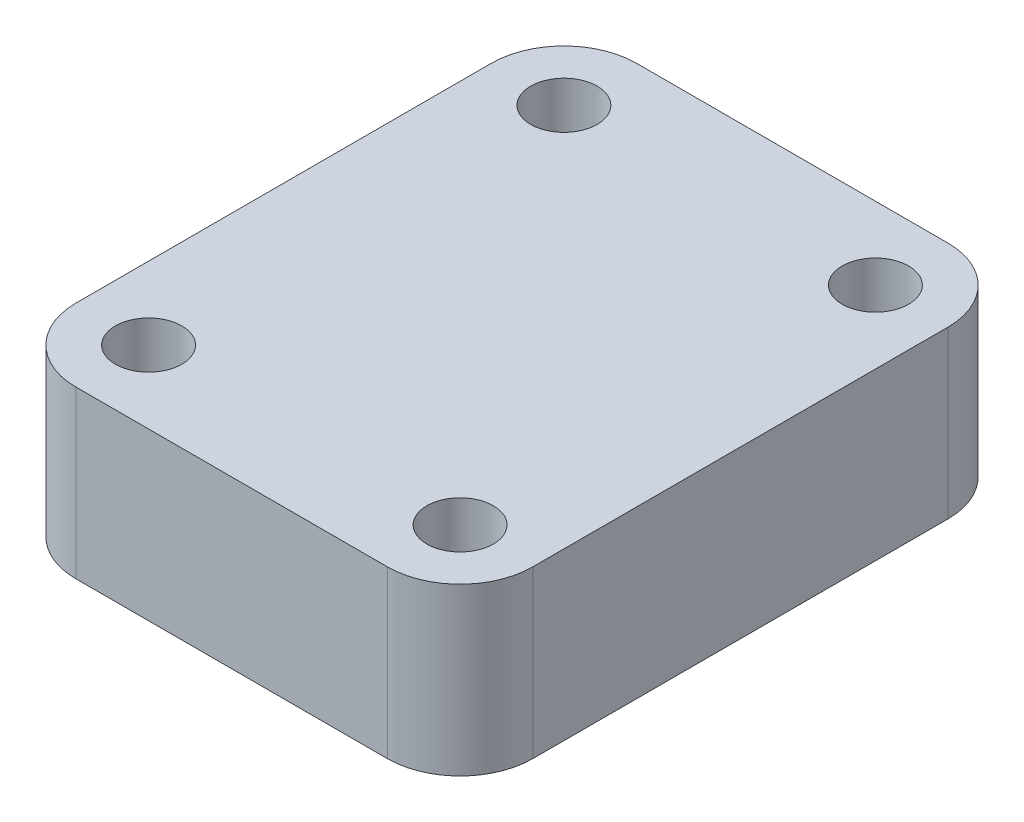
ISO-10303-21;
HEADER;
FILE_DESCRIPTION(('STEP AP214'),'2;1');
FILE_NAME('part.step','',(''),(''),'','','');
FILE_SCHEMA(('AUTOMOTIVE_DESIGN { 1 0 10303 214 1 1 1 1 }'));
ENDSEC;
DATA;
#1=APPLICATION_CONTEXT('core data for automotive mechanical design processes');
#2=APPLICATION_PROTOCOL_DEFINITION('international standard','automotive_design',2000,#1);
#3=PRODUCT_CONTEXT('',#1,'mechanical');
#4=PRODUCT('Part','Part','',(#3));
#5=PRODUCT_RELATED_PRODUCT_CATEGORY('part','',(#4));
#6=PRODUCT_DEFINITION_FORMATION('','',#4);
#7=PRODUCT_DEFINITION_CONTEXT('part definition',#1,'design');
#8=PRODUCT_DEFINITION('design','',#6,#7);
#9=PRODUCT_DEFINITION_SHAPE('','',#8);
#10=(LENGTH_UNIT() NAMED_UNIT(*) SI_UNIT(.MILLI.,.METRE.));
#11=(NAMED_UNIT(*) PLANE_ANGLE_UNIT() SI_UNIT($,.RADIAN.));
#12=(NAMED_UNIT(*) SI_UNIT($,.STERADIAN.) SOLID_ANGLE_UNIT());
#13=UNCERTAINTY_MEASURE_WITH_UNIT(LENGTH_MEASURE(1.E-05),#10,'distance_accuracy_value','');
#14=(GEOMETRIC_REPRESENTATION_CONTEXT(3) GLOBAL_UNCERTAINTY_ASSIGNED_CONTEXT((#13)) GLOBAL_UNIT_ASSIGNED_CONTEXT((#10,
#11,#12)) REPRESENTATION_CONTEXT('',''));
#15=CARTESIAN_POINT('',(0.,0.,0.));
#16=DIRECTION('',(0.,0.,1.));
#17=DIRECTION('',(1.,0.,0.));
#18=AXIS2_PLACEMENT_3D('',#15,#16,#17);
#19=CARTESIAN_POINT('',(-11.,8.,13.5));
#20=DIRECTION('',(1.,0.,0.));
#21=DIRECTION('',(0.,0.,-1.));
#22=AXIS2_PLACEMENT_3D('',#19,#20,#21);
#23=PLANE('',#22);
#24=DIRECTION('',(0.,0.,1.));
#25=VECTOR('',#24,1.);
#26=CARTESIAN_POINT('',(-11.,8.,13.5));
#27=LINE('',#26,#25);
#28=CARTESIAN_POINT('',(-11.,8.,-10.));
#29=VERTEX_POINT('',#28);
#30=CARTESIAN_POINT('',(-11.,8.,10.));
#31=VERTEX_POINT('',#30);
#32=EDGE_CURVE('E124',#29,#31,#27,.T.);
#33=ORIENTED_EDGE('',*,*,#32,.F.);
#34=DIRECTION('',(0.,-1.,0.));
#35=VECTOR('',#34,1.);
#36=CARTESIAN_POINT('',(-11.,8.,-10.));
#37=LINE('',#36,#35);
#38=CARTESIAN_POINT('',(-11.,0.,-10.));
#39=VERTEX_POINT('',#38);
#40=EDGE_CURVE('E109',#29,#39,#37,.T.);
#41=ORIENTED_EDGE('',*,*,#40,.T.);
#42=DIRECTION('',(0.,0.,1.));
#43=VECTOR('',#42,1.);
#44=CARTESIAN_POINT('',(-11.,0.,13.5));
#45=LINE('',#44,#43);
#46=CARTESIAN_POINT('',(-11.,0.,10.));
#47=VERTEX_POINT('',#46);
#48=EDGE_CURVE('E121',#39,#47,#45,.T.);
#49=ORIENTED_EDGE('',*,*,#48,.T.);
#50=DIRECTION('',(0.,-1.,0.));
#51=VECTOR('',#50,1.);
#52=CARTESIAN_POINT('',(-11.,8.,10.));
#53=LINE('',#52,#51);
#54=EDGE_CURVE('E126',#47,#31,#53,.F.);
#55=ORIENTED_EDGE('',*,*,#54,.T.);
#56=EDGE_LOOP('',(#33,#41,#49,#55));
#57=FACE_BOUND('',#56,.T.);
#58=ADVANCED_FACE('F39',(#57),#23,.F.);
#59=CARTESIAN_POINT('',(11.,8.,13.5));
#60=DIRECTION('',(0.,0.,-1.));
#61=DIRECTION('',(-1.,0.,0.));
#62=AXIS2_PLACEMENT_3D('',#59,#60,#61);
#63=PLANE('',#62);
#64=DIRECTION('',(1.,0.,0.));
#65=VECTOR('',#64,1.);
#66=CARTESIAN_POINT('',(11.,0.,13.5));
#67=LINE('',#66,#65);
#68=CARTESIAN_POINT('',(-7.5,0.,13.5));
#69=VERTEX_POINT('',#68);
#70=CARTESIAN_POINT('',(7.5,0.,13.5));
#71=VERTEX_POINT('',#70);
#72=EDGE_CURVE('E130',#69,#71,#67,.T.);
#73=ORIENTED_EDGE('',*,*,#72,.T.);
#74=DIRECTION('',(0.,-1.,0.));
#75=VECTOR('',#74,1.);
#76=CARTESIAN_POINT('',(7.5,8.,13.5));
#77=LINE('',#76,#75);
#78=CARTESIAN_POINT('',(7.5,8.,13.5));
#79=VERTEX_POINT('',#78);
#80=EDGE_CURVE('E11',#71,#79,#77,.F.);
#81=ORIENTED_EDGE('',*,*,#80,.T.);
#82=DIRECTION('',(1.,0.,0.));
#83=VECTOR('',#82,1.);
#84=CARTESIAN_POINT('',(11.,8.,13.5));
#85=LINE('',#84,#83);
#86=CARTESIAN_POINT('',(-7.5,8.,13.5));
#87=VERTEX_POINT('',#86);
#88=EDGE_CURVE('E170',#87,#79,#85,.T.);
#89=ORIENTED_EDGE('',*,*,#88,.F.);
#90=DIRECTION('',(0.,-1.,0.));
#91=VECTOR('',#90,1.);
#92=CARTESIAN_POINT('',(-7.5,8.,13.5));
#93=LINE('',#92,#91);
#94=EDGE_CURVE('E47',#87,#69,#93,.T.);
#95=ORIENTED_EDGE('',*,*,#94,.T.);
#96=EDGE_LOOP('',(#73,#81,#89,#95));
#97=FACE_BOUND('',#96,.T.);
#98=ADVANCED_FACE('F168',(#97),#63,.F.);
#99=CARTESIAN_POINT('',(11.,8.,13.5));
#100=DIRECTION('',(-1.,0.,0.));
#101=DIRECTION('',(0.,0.,1.));
#102=AXIS2_PLACEMENT_3D('',#99,#100,#101);
#103=PLANE('',#102);
#104=DIRECTION('',(0.,0.,-1.));
#105=VECTOR('',#104,1.);
#106=CARTESIAN_POINT('',(11.,0.,13.5));
#107=LINE('',#106,#105);
#108=CARTESIAN_POINT('',(11.,0.,10.));
#109=VERTEX_POINT('',#108);
#110=CARTESIAN_POINT('',(11.,0.,-10.));
#111=VERTEX_POINT('',#110);
#112=EDGE_CURVE('E134',#109,#111,#107,.T.);
#113=ORIENTED_EDGE('',*,*,#112,.T.);
#114=DIRECTION('',(0.,-1.,0.));
#115=VECTOR('',#114,1.);
#116=CARTESIAN_POINT('',(11.,8.,-10.));
#117=LINE('',#116,#115);
#118=CARTESIAN_POINT('',(11.,8.,-10.));
#119=VERTEX_POINT('',#118);
#120=EDGE_CURVE('E54',#111,#119,#117,.F.);
#121=ORIENTED_EDGE('',*,*,#120,.T.);
#122=DIRECTION('',(0.,0.,-1.));
#123=VECTOR('',#122,1.);
#124=CARTESIAN_POINT('',(11.,8.,13.5));
#125=LINE('',#124,#123);
#126=CARTESIAN_POINT('',(11.,8.,10.));
#127=VERTEX_POINT('',#126);
#128=EDGE_CURVE('E178',#127,#119,#125,.T.);
#129=ORIENTED_EDGE('',*,*,#128,.F.);
#130=DIRECTION('',(0.,-1.,0.));
#131=VECTOR('',#130,1.);
#132=CARTESIAN_POINT('',(11.,8.,10.));
#133=LINE('',#132,#131);
#134=EDGE_CURVE('E161',#127,#109,#133,.T.);
#135=ORIENTED_EDGE('',*,*,#134,.T.);
#136=EDGE_LOOP('',(#113,#121,#129,#135));
#137=FACE_BOUND('',#136,.T.);
#138=ADVANCED_FACE('F177',(#137),#103,.F.);
#139=CARTESIAN_POINT('',(11.,8.,-13.5));
#140=DIRECTION('',(0.,0.,1.));
#141=DIRECTION('',(1.,0.,0.));
#142=AXIS2_PLACEMENT_3D('',#139,#140,#141);
#143=PLANE('',#142);
#144=DIRECTION('',(-1.,0.,0.));
#145=VECTOR('',#144,1.);
#146=CARTESIAN_POINT('',(11.,0.,-13.5));
#147=LINE('',#146,#145);
#148=CARTESIAN_POINT('',(7.5,0.,-13.5));
#149=VERTEX_POINT('',#148);
#150=CARTESIAN_POINT('',(-7.5,0.,-13.5));
#151=VERTEX_POINT('',#150);
#152=EDGE_CURVE('E144',#149,#151,#147,.T.);
#153=ORIENTED_EDGE('',*,*,#152,.T.);
#154=DIRECTION('',(0.,-1.,0.));
#155=VECTOR('',#154,1.);
#156=CARTESIAN_POINT('',(-7.5,8.,-13.5));
#157=LINE('',#156,#155);
#158=CARTESIAN_POINT('',(-7.5,8.,-13.5));
#159=VERTEX_POINT('',#158);
#160=EDGE_CURVE('E110',#151,#159,#157,.F.);
#161=ORIENTED_EDGE('',*,*,#160,.T.);
#162=DIRECTION('',(-1.,0.,0.));
#163=VECTOR('',#162,1.);
#164=CARTESIAN_POINT('',(11.,8.,-13.5));
#165=LINE('',#164,#163);
#166=CARTESIAN_POINT('',(7.5,8.,-13.5));
#167=VERTEX_POINT('',#166);
#168=EDGE_CURVE('E140',#167,#159,#165,.T.);
#169=ORIENTED_EDGE('',*,*,#168,.F.);
#170=DIRECTION('',(0.,-1.,0.));
#171=VECTOR('',#170,1.);
#172=CARTESIAN_POINT('',(7.5,8.,-13.5));
#173=LINE('',#172,#171);
#174=EDGE_CURVE('E115',#167,#149,#173,.T.);
#175=ORIENTED_EDGE('',*,*,#174,.T.);
#176=EDGE_LOOP('',(#153,#161,#169,#175));
#177=FACE_BOUND('',#176,.T.);
#178=ADVANCED_FACE('F210',(#177),#143,.F.);
#179=CARTESIAN_POINT('',(0.,8.,0.));
#180=DIRECTION('',(0.,1.,0.));
#181=DIRECTION('',(0.,0.,1.));
#182=AXIS2_PLACEMENT_3D('',#179,#180,#181);
#183=PLANE('',#182);
#184=CARTESIAN_POINT('',(-7.5,8.,10.));
#185=DIRECTION('',(0.,1.,0.));
#186=DIRECTION('',(0.,0.,1.));
#187=AXIS2_PLACEMENT_3D('',#184,#185,#186);
#188=CIRCLE('',#187,1.59999999999999);
#189=CARTESIAN_POINT('',(-7.5,8.,11.6));
#190=VERTEX_POINT('',#189);
#191=EDGE_CURVE('E201',#190,#190,#188,.T.);
#192=ORIENTED_EDGE('',*,*,#191,.F.);
#193=EDGE_LOOP('',(#192));
#194=FACE_BOUND('',#193,.T.);
#195=CARTESIAN_POINT('',(-7.5,8.,-10.));
#196=DIRECTION('',(0.,1.,0.));
#197=DIRECTION('',(0.,0.,1.));
#198=AXIS2_PLACEMENT_3D('',#195,#196,#197);
#199=CIRCLE('',#198,1.59999999999999);
#200=CARTESIAN_POINT('',(-7.5,8.,-8.40000000000001));
#201=VERTEX_POINT('',#200);
#202=EDGE_CURVE('E195',#201,#201,#199,.T.);
#203=ORIENTED_EDGE('',*,*,#202,.F.);
#204=EDGE_LOOP('',(#203));
#205=FACE_BOUND('',#204,.T.);
#206=CARTESIAN_POINT('',(7.5,8.,-10.));
#207=DIRECTION('',(0.,1.,0.));
#208=DIRECTION('',(0.,0.,1.));
#209=AXIS2_PLACEMENT_3D('',#206,#207,#208);
#210=CIRCLE('',#209,1.59999999999999);
#211=CARTESIAN_POINT('',(7.5,8.,-8.40000000000001));
#212=VERTEX_POINT('',#211);
#213=EDGE_CURVE('E189',#212,#212,#210,.T.);
#214=ORIENTED_EDGE('',*,*,#213,.F.);
#215=EDGE_LOOP('',(#214));
#216=FACE_BOUND('',#215,.T.);
#217=CARTESIAN_POINT('',(7.5,8.,10.));
#218=DIRECTION('',(0.,1.,0.));
#219=DIRECTION('',(0.,0.,1.));
#220=AXIS2_PLACEMENT_3D('',#217,#218,#219);
#221=CIRCLE('',#220,1.59999999999999);
#222=CARTESIAN_POINT('',(7.5,8.,11.6));
#223=VERTEX_POINT('',#222);
#224=EDGE_CURVE('E137',#223,#223,#221,.T.);
#225=ORIENTED_EDGE('',*,*,#224,.F.);
#226=EDGE_LOOP('',(#225));
#227=FACE_BOUND('',#226,.T.);
#228=ORIENTED_EDGE('',*,*,#168,.T.);
#229=CARTESIAN_POINT('',(-7.5,8.,-10.));
#230=DIRECTION('',(0.,1.,0.));
#231=DIRECTION('',(0.,0.,1.));
#232=AXIS2_PLACEMENT_3D('',#229,#230,#231);
#233=CIRCLE('',#232,3.5);
#234=EDGE_CURVE('E159',#159,#29,#233,.T.);
#235=ORIENTED_EDGE('',*,*,#234,.T.);
#236=ORIENTED_EDGE('',*,*,#32,.T.);
#237=CARTESIAN_POINT('',(-7.5,8.,10.));
#238=DIRECTION('',(0.,1.,0.));
#239=DIRECTION('',(0.,0.,1.));
#240=AXIS2_PLACEMENT_3D('',#237,#238,#239);
#241=CIRCLE('',#240,3.5);
#242=EDGE_CURVE('E154',#31,#87,#241,.T.);
#243=ORIENTED_EDGE('',*,*,#242,.T.);
#244=ORIENTED_EDGE('',*,*,#88,.T.);
#245=CARTESIAN_POINT('',(7.5,8.,10.));
#246=DIRECTION('',(0.,1.,0.));
#247=DIRECTION('',(0.,0.,1.));
#248=AXIS2_PLACEMENT_3D('',#245,#246,#247);
#249=CIRCLE('',#248,3.5);
#250=EDGE_CURVE('E61',#79,#127,#249,.T.);
#251=ORIENTED_EDGE('',*,*,#250,.T.);
#252=ORIENTED_EDGE('',*,*,#128,.T.);
#253=CARTESIAN_POINT('',(7.5,8.,-10.));
#254=DIRECTION('',(0.,1.,0.));
#255=DIRECTION('',(0.,0.,1.));
#256=AXIS2_PLACEMENT_3D('',#253,#254,#255);
#257=CIRCLE('',#256,3.5);
#258=EDGE_CURVE('E157',#119,#167,#257,.T.);
#259=ORIENTED_EDGE('',*,*,#258,.T.);
#260=EDGE_LOOP('',(#228,#235,#236,#243,#244,#251,#252,#259));
#261=FACE_BOUND('',#260,.T.);
#262=ADVANCED_FACE('F207',(#194,#205,#216,#227,#261),#183,.T.);
#263=CARTESIAN_POINT('',(0.,0.,0.));
#264=DIRECTION('',(0.,1.,0.));
#265=DIRECTION('',(0.,0.,1.));
#266=AXIS2_PLACEMENT_3D('',#263,#264,#265);
#267=PLANE('',#266);
#268=CARTESIAN_POINT('',(-7.5,0.,10.));
#269=DIRECTION('',(0.,1.,0.));
#270=DIRECTION('',(0.,0.,1.));
#271=AXIS2_PLACEMENT_3D('',#268,#269,#270);
#272=CIRCLE('',#271,1.6);
#273=CARTESIAN_POINT('',(-7.5,0.,11.6));
#274=VERTEX_POINT('',#273);
#275=EDGE_CURVE('E198',#274,#274,#272,.T.);
#276=ORIENTED_EDGE('',*,*,#275,.T.);
#277=EDGE_LOOP('',(#276));
#278=FACE_BOUND('',#277,.T.);
#279=CARTESIAN_POINT('',(-7.5,0.,-10.));
#280=DIRECTION('',(0.,1.,0.));
#281=DIRECTION('',(0.,0.,1.));
#282=AXIS2_PLACEMENT_3D('',#279,#280,#281);
#283=CIRCLE('',#282,1.6);
#284=CARTESIAN_POINT('',(-7.5,0.,-8.4));
#285=VERTEX_POINT('',#284);
#286=EDGE_CURVE('E192',#285,#285,#283,.T.);
#287=ORIENTED_EDGE('',*,*,#286,.T.);
#288=EDGE_LOOP('',(#287));
#289=FACE_BOUND('',#288,.T.);
#290=CARTESIAN_POINT('',(7.5,0.,-10.));
#291=DIRECTION('',(0.,1.,0.));
#292=DIRECTION('',(0.,0.,1.));
#293=AXIS2_PLACEMENT_3D('',#290,#291,#292);
#294=CIRCLE('',#293,1.6);
#295=CARTESIAN_POINT('',(7.5,0.,-8.4));
#296=VERTEX_POINT('',#295);
#297=EDGE_CURVE('E186',#296,#296,#294,.T.);
#298=ORIENTED_EDGE('',*,*,#297,.T.);
#299=EDGE_LOOP('',(#298));
#300=FACE_BOUND('',#299,.T.);
#301=CARTESIAN_POINT('',(7.5,0.,10.));
#302=DIRECTION('',(0.,1.,0.));
#303=DIRECTION('',(0.,0.,1.));
#304=AXIS2_PLACEMENT_3D('',#301,#302,#303);
#305=CIRCLE('',#304,1.6);
#306=CARTESIAN_POINT('',(7.5,0.,11.6));
#307=VERTEX_POINT('',#306);
#308=EDGE_CURVE('E131',#307,#307,#305,.T.);
#309=ORIENTED_EDGE('',*,*,#308,.T.);
#310=EDGE_LOOP('',(#309));
#311=FACE_BOUND('',#310,.T.);
#312=ORIENTED_EDGE('',*,*,#48,.F.);
#313=CARTESIAN_POINT('',(-7.5,0.,-10.));
#314=DIRECTION('',(0.,1.,0.));
#315=DIRECTION('',(0.,0.,1.));
#316=AXIS2_PLACEMENT_3D('',#313,#314,#315);
#317=CIRCLE('',#316,3.5);
#318=EDGE_CURVE('E105',#39,#151,#317,.F.);
#319=ORIENTED_EDGE('',*,*,#318,.T.);
#320=ORIENTED_EDGE('',*,*,#152,.F.);
#321=CARTESIAN_POINT('',(7.5,0.,-10.));
#322=DIRECTION('',(0.,1.,0.));
#323=DIRECTION('',(0.,0.,1.));
#324=AXIS2_PLACEMENT_3D('',#321,#322,#323);
#325=CIRCLE('',#324,3.5);
#326=EDGE_CURVE('E116',#149,#111,#325,.F.);
#327=ORIENTED_EDGE('',*,*,#326,.T.);
#328=ORIENTED_EDGE('',*,*,#112,.F.);
#329=CARTESIAN_POINT('',(7.5,0.,10.));
#330=DIRECTION('',(0.,1.,0.));
#331=DIRECTION('',(0.,0.,1.));
#332=AXIS2_PLACEMENT_3D('',#329,#330,#331);
#333=CIRCLE('',#332,3.5);
#334=EDGE_CURVE('E148',#109,#71,#333,.F.);
#335=ORIENTED_EDGE('',*,*,#334,.T.);
#336=ORIENTED_EDGE('',*,*,#72,.F.);
#337=CARTESIAN_POINT('',(-7.5,0.,10.));
#338=DIRECTION('',(0.,1.,0.));
#339=DIRECTION('',(0.,0.,1.));
#340=AXIS2_PLACEMENT_3D('',#337,#338,#339);
#341=CIRCLE('',#340,3.5);
#342=EDGE_CURVE('E125',#69,#47,#341,.F.);
#343=ORIENTED_EDGE('',*,*,#342,.T.);
#344=EDGE_LOOP('',(#312,#319,#320,#327,#328,#335,#336,#343));
#345=FACE_BOUND('',#344,.T.);
#346=ADVANCED_FACE('F128',(#278,#289,#300,#311,#345),#267,.F.);
#347=CARTESIAN_POINT('',(7.5,8.,10.));
#348=DIRECTION('',(0.,1.,0.));
#349=DIRECTION('',(0.,0.,1.));
#350=AXIS2_PLACEMENT_3D('',#347,#348,#349);
#351=CYLINDRICAL_SURFACE('',#350,1.59999999999999);
#352=ORIENTED_EDGE('',*,*,#308,.F.);
#353=EDGE_LOOP('',(#352));
#354=FACE_BOUND('',#353,.T.);
#355=ORIENTED_EDGE('',*,*,#224,.T.);
#356=EDGE_LOOP('',(#355));
#357=FACE_BOUND('',#356,.T.);
#358=ADVANCED_FACE('F241',(#354,#357),#351,.F.);
#359=CARTESIAN_POINT('',(7.5,8.,-10.));
#360=DIRECTION('',(0.,1.,0.));
#361=DIRECTION('',(0.,0.,1.));
#362=AXIS2_PLACEMENT_3D('',#359,#360,#361);
#363=CYLINDRICAL_SURFACE('',#362,1.59999999999999);
#364=ORIENTED_EDGE('',*,*,#297,.F.);
#365=EDGE_LOOP('',(#364));
#366=FACE_BOUND('',#365,.T.);
#367=ORIENTED_EDGE('',*,*,#213,.T.);
#368=EDGE_LOOP('',(#367));
#369=FACE_BOUND('',#368,.T.);
#370=ADVANCED_FACE('F246',(#366,#369),#363,.F.);
#371=CARTESIAN_POINT('',(-7.5,8.,-10.));
#372=DIRECTION('',(0.,1.,0.));
#373=DIRECTION('',(0.,0.,1.));
#374=AXIS2_PLACEMENT_3D('',#371,#372,#373);
#375=CYLINDRICAL_SURFACE('',#374,1.59999999999999);
#376=ORIENTED_EDGE('',*,*,#286,.F.);
#377=EDGE_LOOP('',(#376));
#378=FACE_BOUND('',#377,.T.);
#379=ORIENTED_EDGE('',*,*,#202,.T.);
#380=EDGE_LOOP('',(#379));
#381=FACE_BOUND('',#380,.T.);
#382=ADVANCED_FACE('F250',(#378,#381),#375,.F.);
#383=CARTESIAN_POINT('',(-7.5,8.,10.));
#384=DIRECTION('',(0.,1.,0.));
#385=DIRECTION('',(0.,0.,1.));
#386=AXIS2_PLACEMENT_3D('',#383,#384,#385);
#387=CYLINDRICAL_SURFACE('',#386,1.59999999999999);
#388=ORIENTED_EDGE('',*,*,#275,.F.);
#389=EDGE_LOOP('',(#388));
#390=FACE_BOUND('',#389,.T.);
#391=ORIENTED_EDGE('',*,*,#191,.T.);
#392=EDGE_LOOP('',(#391));
#393=FACE_BOUND('',#392,.T.);
#394=ADVANCED_FACE('F205',(#390,#393),#387,.F.);
#395=CARTESIAN_POINT('',(-7.5,8.,-10.));
#396=DIRECTION('',(0.,-1.,0.));
#397=DIRECTION('',(0.,0.,-1.));
#398=AXIS2_PLACEMENT_3D('',#395,#396,#397);
#399=CYLINDRICAL_SURFACE('',#398,3.5);
#400=ORIENTED_EDGE('',*,*,#234,.F.);
#401=ORIENTED_EDGE('',*,*,#160,.F.);
#402=ORIENTED_EDGE('',*,*,#318,.F.);
#403=ORIENTED_EDGE('',*,*,#40,.F.);
#404=EDGE_LOOP('',(#400,#401,#402,#403));
#405=FACE_BOUND('',#404,.T.);
#406=ADVANCED_FACE('F108',(#405),#399,.T.);
#407=CARTESIAN_POINT('',(7.5,8.,-10.));
#408=DIRECTION('',(0.,-1.,0.));
#409=DIRECTION('',(0.,0.,-1.));
#410=AXIS2_PLACEMENT_3D('',#407,#408,#409);
#411=CYLINDRICAL_SURFACE('',#410,3.5);
#412=ORIENTED_EDGE('',*,*,#258,.F.);
#413=ORIENTED_EDGE('',*,*,#120,.F.);
#414=ORIENTED_EDGE('',*,*,#326,.F.);
#415=ORIENTED_EDGE('',*,*,#174,.F.);
#416=EDGE_LOOP('',(#412,#413,#414,#415));
#417=FACE_BOUND('',#416,.T.);
#418=ADVANCED_FACE('F221',(#417),#411,.T.);
#419=CARTESIAN_POINT('',(7.5,8.,10.));
#420=DIRECTION('',(0.,-1.,0.));
#421=DIRECTION('',(0.,0.,-1.));
#422=AXIS2_PLACEMENT_3D('',#419,#420,#421);
#423=CYLINDRICAL_SURFACE('',#422,3.5);
#424=ORIENTED_EDGE('',*,*,#250,.F.);
#425=ORIENTED_EDGE('',*,*,#80,.F.);
#426=ORIENTED_EDGE('',*,*,#334,.F.);
#427=ORIENTED_EDGE('',*,*,#134,.F.);
#428=EDGE_LOOP('',(#424,#425,#426,#427));
#429=FACE_BOUND('',#428,.T.);
#430=ADVANCED_FACE('F176',(#429),#423,.T.);
#431=CARTESIAN_POINT('',(-7.5,8.,10.));
#432=DIRECTION('',(0.,-1.,0.));
#433=DIRECTION('',(0.,0.,-1.));
#434=AXIS2_PLACEMENT_3D('',#431,#432,#433);
#435=CYLINDRICAL_SURFACE('',#434,3.5);
#436=ORIENTED_EDGE('',*,*,#242,.F.);
#437=ORIENTED_EDGE('',*,*,#54,.F.);
#438=ORIENTED_EDGE('',*,*,#342,.F.);
#439=ORIENTED_EDGE('',*,*,#94,.F.);
#440=EDGE_LOOP('',(#436,#437,#438,#439));
#441=FACE_BOUND('',#440,.T.);
#442=ADVANCED_FACE('F41',(#441),#435,.T.);
#443=CLOSED_SHELL('',(#58,#98,#138,#178,#262,#346,#358,#370,#382,#394,#406,#418,#430,#442));
#444=MANIFOLD_SOLID_BREP('B2',#443);
#445=ADVANCED_BREP_SHAPE_REPRESENTATION('',(#18,#444),#14);
#446=SHAPE_DEFINITION_REPRESENTATION(#9,#445);
ENDSEC;
END-ISO-10303-21;
